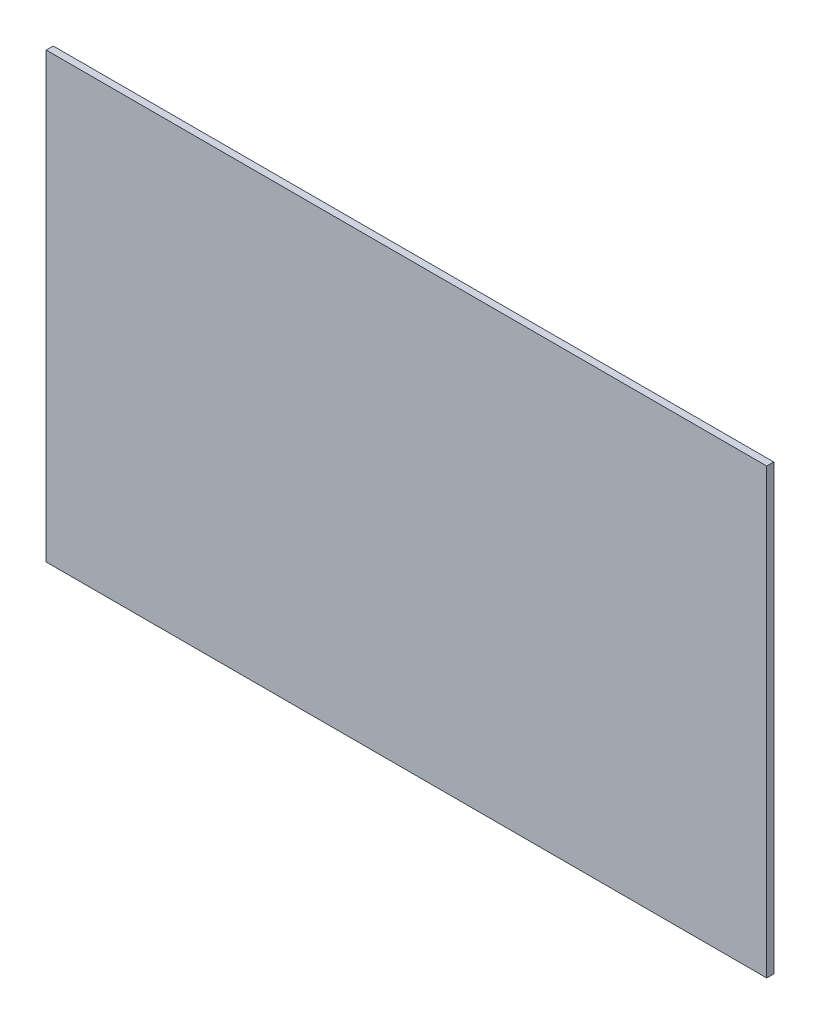
ISO-10303-21;
HEADER;
FILE_DESCRIPTION(('STEP AP214'),'2;1');
FILE_NAME('part.step','',(''),(''),'','','');
FILE_SCHEMA(('AUTOMOTIVE_DESIGN { 1 0 10303 214 1 1 1 1 }'));
ENDSEC;
DATA;
#1=APPLICATION_CONTEXT('core data for automotive mechanical design processes');
#2=APPLICATION_PROTOCOL_DEFINITION('international standard','automotive_design',2000,#1);
#3=PRODUCT_CONTEXT('',#1,'mechanical');
#4=PRODUCT('Part','Part','',(#3));
#5=PRODUCT_RELATED_PRODUCT_CATEGORY('part','',(#4));
#6=PRODUCT_DEFINITION_FORMATION('','',#4);
#7=PRODUCT_DEFINITION_CONTEXT('part definition',#1,'design');
#8=PRODUCT_DEFINITION('design','',#6,#7);
#9=PRODUCT_DEFINITION_SHAPE('','',#8);
#10=(LENGTH_UNIT() NAMED_UNIT(*) SI_UNIT(.MILLI.,.METRE.));
#11=(NAMED_UNIT(*) PLANE_ANGLE_UNIT() SI_UNIT($,.RADIAN.));
#12=(NAMED_UNIT(*) SI_UNIT($,.STERADIAN.) SOLID_ANGLE_UNIT());
#13=UNCERTAINTY_MEASURE_WITH_UNIT(LENGTH_MEASURE(1.E-05),#10,'distance_accuracy_value','');
#14=(GEOMETRIC_REPRESENTATION_CONTEXT(3) GLOBAL_UNCERTAINTY_ASSIGNED_CONTEXT((#13)) GLOBAL_UNIT_ASSIGNED_CONTEXT((#10,
#11,#12)) REPRESENTATION_CONTEXT('',''));
#15=CARTESIAN_POINT('',(0.,0.,0.));
#16=DIRECTION('',(0.,0.,1.));
#17=DIRECTION('',(1.,0.,0.));
#18=AXIS2_PLACEMENT_3D('',#15,#16,#17);
#19=CARTESIAN_POINT('',(0.,0.,6.35));
#20=DIRECTION('',(1.,0.,0.));
#21=DIRECTION('',(0.,0.,-1.));
#22=AXIS2_PLACEMENT_3D('',#19,#20,#21);
#23=PLANE('',#22);
#24=DIRECTION('',(0.,-1.,0.));
#25=VECTOR('',#24,1.);
#26=CARTESIAN_POINT('',(0.,0.,0.));
#27=LINE('',#26,#25);
#28=CARTESIAN_POINT('',(0.,400.,0.));
#29=VERTEX_POINT('',#28);
#30=CARTESIAN_POINT('',(0.,0.,0.));
#31=VERTEX_POINT('',#30);
#32=EDGE_CURVE('E96',#29,#31,#27,.T.);
#33=ORIENTED_EDGE('',*,*,#32,.T.);
#34=DIRECTION('',(0.,0.,-1.));
#35=VECTOR('',#34,1.);
#36=CARTESIAN_POINT('',(0.,0.,6.35));
#37=LINE('',#36,#35);
#38=CARTESIAN_POINT('',(0.,0.,6.35));
#39=VERTEX_POINT('',#38);
#40=EDGE_CURVE('E11',#39,#31,#37,.T.);
#41=ORIENTED_EDGE('',*,*,#40,.F.);
#42=DIRECTION('',(0.,-1.,0.));
#43=VECTOR('',#42,1.);
#44=CARTESIAN_POINT('',(0.,0.,6.35));
#45=LINE('',#44,#43);
#46=CARTESIAN_POINT('',(0.,400.,6.35));
#47=VERTEX_POINT('',#46);
#48=EDGE_CURVE('E84',#47,#39,#45,.T.);
#49=ORIENTED_EDGE('',*,*,#48,.F.);
#50=DIRECTION('',(0.,0.,-1.));
#51=VECTOR('',#50,1.);
#52=CARTESIAN_POINT('',(0.,400.,6.35));
#53=LINE('',#52,#51);
#54=EDGE_CURVE('E92',#47,#29,#53,.T.);
#55=ORIENTED_EDGE('',*,*,#54,.T.);
#56=EDGE_LOOP('',(#33,#41,#49,#55));
#57=FACE_BOUND('',#56,.T.);
#58=ADVANCED_FACE('F33',(#57),#23,.F.);
#59=CARTESIAN_POINT('',(0.,0.,6.35));
#60=DIRECTION('',(0.,1.,0.));
#61=DIRECTION('',(0.,0.,1.));
#62=AXIS2_PLACEMENT_3D('',#59,#60,#61);
#63=PLANE('',#62);
#64=DIRECTION('',(1.,0.,0.));
#65=VECTOR('',#64,1.);
#66=CARTESIAN_POINT('',(0.,0.,0.));
#67=LINE('',#66,#65);
#68=CARTESIAN_POINT('',(650.,0.,0.));
#69=VERTEX_POINT('',#68);
#70=EDGE_CURVE('E88',#31,#69,#67,.T.);
#71=ORIENTED_EDGE('',*,*,#70,.T.);
#72=DIRECTION('',(0.,0.,-1.));
#73=VECTOR('',#72,1.);
#74=CARTESIAN_POINT('',(650.,0.,6.35));
#75=LINE('',#74,#73);
#76=CARTESIAN_POINT('',(650.,0.,6.35));
#77=VERTEX_POINT('',#76);
#78=EDGE_CURVE('E41',#77,#69,#75,.T.);
#79=ORIENTED_EDGE('',*,*,#78,.F.);
#80=DIRECTION('',(1.,0.,0.));
#81=VECTOR('',#80,1.);
#82=CARTESIAN_POINT('',(0.,0.,6.35));
#83=LINE('',#82,#81);
#84=EDGE_CURVE('E79',#39,#77,#83,.T.);
#85=ORIENTED_EDGE('',*,*,#84,.F.);
#86=ORIENTED_EDGE('',*,*,#40,.T.);
#87=EDGE_LOOP('',(#71,#79,#85,#86));
#88=FACE_BOUND('',#87,.T.);
#89=ADVANCED_FACE('F87',(#88),#63,.F.);
#90=CARTESIAN_POINT('',(650.,0.,6.35));
#91=DIRECTION('',(-1.,0.,0.));
#92=DIRECTION('',(0.,0.,1.));
#93=AXIS2_PLACEMENT_3D('',#90,#91,#92);
#94=PLANE('',#93);
#95=DIRECTION('',(0.,1.,0.));
#96=VECTOR('',#95,1.);
#97=CARTESIAN_POINT('',(650.,0.,0.));
#98=LINE('',#97,#96);
#99=CARTESIAN_POINT('',(650.,400.,0.));
#100=VERTEX_POINT('',#99);
#101=EDGE_CURVE('E66',#69,#100,#98,.T.);
#102=ORIENTED_EDGE('',*,*,#101,.T.);
#103=DIRECTION('',(0.,0.,-1.));
#104=VECTOR('',#103,1.);
#105=CARTESIAN_POINT('',(650.,400.,6.35));
#106=LINE('',#105,#104);
#107=CARTESIAN_POINT('',(650.,400.,6.35));
#108=VERTEX_POINT('',#107);
#109=EDGE_CURVE('E89',#108,#100,#106,.T.);
#110=ORIENTED_EDGE('',*,*,#109,.F.);
#111=DIRECTION('',(0.,1.,0.));
#112=VECTOR('',#111,1.);
#113=CARTESIAN_POINT('',(650.,0.,6.35));
#114=LINE('',#113,#112);
#115=EDGE_CURVE('E82',#77,#108,#114,.T.);
#116=ORIENTED_EDGE('',*,*,#115,.F.);
#117=ORIENTED_EDGE('',*,*,#78,.T.);
#118=EDGE_LOOP('',(#102,#110,#116,#117));
#119=FACE_BOUND('',#118,.T.);
#120=ADVANCED_FACE('F90',(#119),#94,.F.);
#121=CARTESIAN_POINT('',(0.,400.,6.35));
#122=DIRECTION('',(0.,-1.,0.));
#123=DIRECTION('',(0.,0.,-1.));
#124=AXIS2_PLACEMENT_3D('',#121,#122,#123);
#125=PLANE('',#124);
#126=DIRECTION('',(-1.,0.,0.));
#127=VECTOR('',#126,1.);
#128=CARTESIAN_POINT('',(0.,400.,0.));
#129=LINE('',#128,#127);
#130=EDGE_CURVE('E72',#100,#29,#129,.T.);
#131=ORIENTED_EDGE('',*,*,#130,.T.);
#132=ORIENTED_EDGE('',*,*,#54,.F.);
#133=DIRECTION('',(-1.,0.,0.));
#134=VECTOR('',#133,1.);
#135=CARTESIAN_POINT('',(0.,400.,6.35));
#136=LINE('',#135,#134);
#137=EDGE_CURVE('E49',#108,#47,#136,.T.);
#138=ORIENTED_EDGE('',*,*,#137,.F.);
#139=ORIENTED_EDGE('',*,*,#109,.T.);
#140=EDGE_LOOP('',(#131,#132,#138,#139));
#141=FACE_BOUND('',#140,.T.);
#142=ADVANCED_FACE('F103',(#141),#125,.F.);
#143=CARTESIAN_POINT('',(0.,0.,6.35));
#144=DIRECTION('',(0.,0.,-1.));
#145=DIRECTION('',(-1.,0.,0.));
#146=AXIS2_PLACEMENT_3D('',#143,#144,#145);
#147=PLANE('',#146);
#148=ORIENTED_EDGE('',*,*,#48,.T.);
#149=ORIENTED_EDGE('',*,*,#84,.T.);
#150=ORIENTED_EDGE('',*,*,#115,.T.);
#151=ORIENTED_EDGE('',*,*,#137,.T.);
#152=EDGE_LOOP('',(#148,#149,#150,#151));
#153=FACE_BOUND('',#152,.T.);
#154=ADVANCED_FACE('F80',(#153),#147,.F.);
#155=CARTESIAN_POINT('',(0.,0.,0.));
#156=DIRECTION('',(0.,0.,-1.));
#157=DIRECTION('',(-1.,0.,0.));
#158=AXIS2_PLACEMENT_3D('',#155,#156,#157);
#159=PLANE('',#158);
#160=ORIENTED_EDGE('',*,*,#32,.F.);
#161=ORIENTED_EDGE('',*,*,#130,.F.);
#162=ORIENTED_EDGE('',*,*,#101,.F.);
#163=ORIENTED_EDGE('',*,*,#70,.F.);
#164=EDGE_LOOP('',(#160,#161,#162,#163));
#165=FACE_BOUND('',#164,.T.);
#166=ADVANCED_FACE('F106',(#165),#159,.T.);
#167=CLOSED_SHELL('',(#58,#89,#120,#142,#154,#166));
#168=MANIFOLD_SOLID_BREP('B2',#167);
#169=ADVANCED_BREP_SHAPE_REPRESENTATION('',(#18,#168),#14);
#170=SHAPE_DEFINITION_REPRESENTATION(#9,#169);
ENDSEC;
END-ISO-10303-21;
